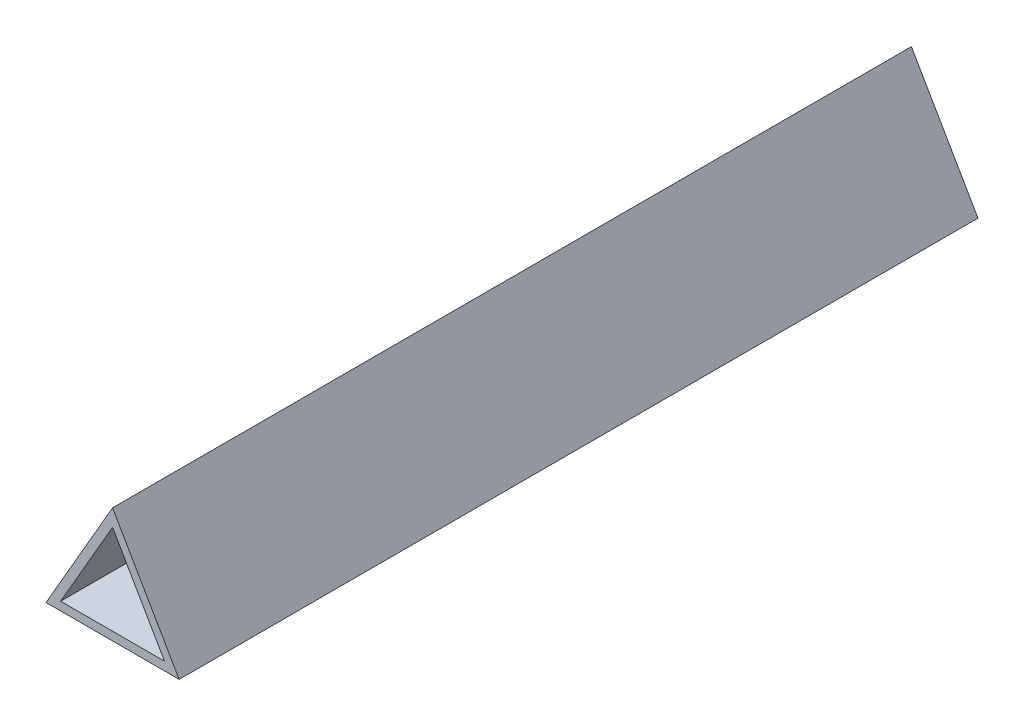
ISO-10303-21;
HEADER;
FILE_DESCRIPTION(('STEP AP214'),'2;1');
FILE_NAME('part.step','',(''),(''),'','','');
FILE_SCHEMA(('AUTOMOTIVE_DESIGN { 1 0 10303 214 1 1 1 1 }'));
ENDSEC;
DATA;
#1=APPLICATION_CONTEXT('core data for automotive mechanical design processes');
#2=APPLICATION_PROTOCOL_DEFINITION('international standard','automotive_design',2000,#1);
#3=PRODUCT_CONTEXT('',#1,'mechanical');
#4=PRODUCT('Part','Part','',(#3));
#5=PRODUCT_RELATED_PRODUCT_CATEGORY('part','',(#4));
#6=PRODUCT_DEFINITION_FORMATION('','',#4);
#7=PRODUCT_DEFINITION_CONTEXT('part definition',#1,'design');
#8=PRODUCT_DEFINITION('design','',#6,#7);
#9=PRODUCT_DEFINITION_SHAPE('','',#8);
#10=(LENGTH_UNIT() NAMED_UNIT(*) SI_UNIT(.MILLI.,.METRE.));
#11=(NAMED_UNIT(*) PLANE_ANGLE_UNIT() SI_UNIT($,.RADIAN.));
#12=(NAMED_UNIT(*) SI_UNIT($,.STERADIAN.) SOLID_ANGLE_UNIT());
#13=UNCERTAINTY_MEASURE_WITH_UNIT(LENGTH_MEASURE(1.E-05),#10,'distance_accuracy_value','');
#14=(GEOMETRIC_REPRESENTATION_CONTEXT(3) GLOBAL_UNCERTAINTY_ASSIGNED_CONTEXT((#13)) GLOBAL_UNIT_ASSIGNED_CONTEXT((#10,
#11,#12)) REPRESENTATION_CONTEXT('',''));
#15=CARTESIAN_POINT('',(0.,0.,0.));
#16=DIRECTION('',(0.,0.,1.));
#17=DIRECTION('',(1.,0.,0.));
#18=AXIS2_PLACEMENT_3D('',#15,#16,#17);
#19=CARTESIAN_POINT('',(0.,0.,300.));
#20=DIRECTION('',(0.,0.,-1.));
#21=DIRECTION('',(-1.,0.,0.));
#22=AXIS2_PLACEMENT_3D('',#19,#20,#21);
#23=PLANE('',#22);
#24=DIRECTION('',(1.,0.,0.));
#25=VECTOR('',#24,1.);
#26=CARTESIAN_POINT('',(49.9999999999999,-1.60079542462932E-13,300.));
#27=LINE('',#26,#25);
#28=CARTESIAN_POINT('',(0.,0.,300.));
#29=VERTEX_POINT('',#28);
#30=CARTESIAN_POINT('',(49.9999999999999,-1.60079542462932E-13,300.));
#31=VERTEX_POINT('',#30);
#32=EDGE_CURVE('E113',#29,#31,#27,.T.);
#33=ORIENTED_EDGE('',*,*,#32,.T.);
#34=DIRECTION('',(-0.499999999999992,0.866025403784443,0.));
#35=VECTOR('',#34,1.);
#36=CARTESIAN_POINT('',(25.0000000000003,43.301270189222,300.));
#37=LINE('',#36,#35);
#38=CARTESIAN_POINT('',(25.0000000000003,43.301270189222,300.));
#39=VERTEX_POINT('',#38);
#40=EDGE_CURVE('E116',#31,#39,#37,.T.);
#41=ORIENTED_EDGE('',*,*,#40,.T.);
#42=DIRECTION('',(-0.500000000000004,-0.866025403784436,0.));
#43=VECTOR('',#42,1.);
#44=CARTESIAN_POINT('',(0.,0.,300.));
#45=LINE('',#44,#43);
#46=EDGE_CURVE('E119',#39,#29,#45,.T.);
#47=ORIENTED_EDGE('',*,*,#46,.T.);
#48=EDGE_LOOP('',(#33,#41,#47));
#49=FACE_BOUND('',#48,.T.);
#50=DIRECTION('',(-0.499999999999992,0.866025403784443,0.));
#51=VECTOR('',#50,1.);
#52=CARTESIAN_POINT('',(44.5007386859687,3.17499999999999,300.));
#53=LINE('',#52,#51);
#54=CARTESIAN_POINT('',(44.5007386859687,3.17499999999999,300.));
#55=VERTEX_POINT('',#54);
#56=CARTESIAN_POINT('',(25.0000000000003,36.951270189222,300.));
#57=VERTEX_POINT('',#56);
#58=EDGE_CURVE('E86',#55,#57,#53,.T.);
#59=ORIENTED_EDGE('',*,*,#58,.F.);
#60=DIRECTION('',(1.,0.,0.));
#61=VECTOR('',#60,1.);
#62=CARTESIAN_POINT('',(5.49926131403122,3.175,300.));
#63=LINE('',#62,#61);
#64=CARTESIAN_POINT('',(5.49926131403122,3.175,300.));
#65=VERTEX_POINT('',#64);
#66=EDGE_CURVE('E103',#65,#55,#63,.T.);
#67=ORIENTED_EDGE('',*,*,#66,.F.);
#68=DIRECTION('',(-0.500000000000004,-0.866025403784436,0.));
#69=VECTOR('',#68,1.);
#70=CARTESIAN_POINT('',(25.0000000000003,36.951270189222,300.));
#71=LINE('',#70,#69);
#72=EDGE_CURVE('E94',#57,#65,#71,.T.);
#73=ORIENTED_EDGE('',*,*,#72,.F.);
#74=EDGE_LOOP('',(#59,#67,#73));
#75=FACE_BOUND('',#74,.T.);
#76=ADVANCED_FACE('F33',(#49,#75),#23,.F.);
#77=CARTESIAN_POINT('',(0.,0.,0.));
#78=DIRECTION('',(0.,0.,-1.));
#79=DIRECTION('',(-1.,0.,0.));
#80=AXIS2_PLACEMENT_3D('',#77,#78,#79);
#81=PLANE('',#80);
#82=DIRECTION('',(1.,0.,0.));
#83=VECTOR('',#82,1.);
#84=CARTESIAN_POINT('',(49.9999999999999,-1.60079542462932E-13,0.));
#85=LINE('',#84,#83);
#86=CARTESIAN_POINT('',(0.,0.,0.));
#87=VERTEX_POINT('',#86);
#88=CARTESIAN_POINT('',(49.9999999999999,-1.60079542462932E-13,0.));
#89=VERTEX_POINT('',#88);
#90=EDGE_CURVE('E101',#87,#89,#85,.T.);
#91=ORIENTED_EDGE('',*,*,#90,.F.);
#92=DIRECTION('',(-0.500000000000004,-0.866025403784436,0.));
#93=VECTOR('',#92,1.);
#94=CARTESIAN_POINT('',(0.,0.,0.));
#95=LINE('',#94,#93);
#96=CARTESIAN_POINT('',(25.0000000000003,43.301270189222,0.));
#97=VERTEX_POINT('',#96);
#98=EDGE_CURVE('E117',#97,#87,#95,.T.);
#99=ORIENTED_EDGE('',*,*,#98,.F.);
#100=DIRECTION('',(-0.499999999999992,0.866025403784443,0.));
#101=VECTOR('',#100,1.);
#102=CARTESIAN_POINT('',(25.0000000000003,43.301270189222,0.));
#103=LINE('',#102,#101);
#104=EDGE_CURVE('E124',#89,#97,#103,.T.);
#105=ORIENTED_EDGE('',*,*,#104,.F.);
#106=EDGE_LOOP('',(#91,#99,#105));
#107=FACE_BOUND('',#106,.T.);
#108=DIRECTION('',(1.,0.,0.));
#109=VECTOR('',#108,1.);
#110=CARTESIAN_POINT('',(5.49926131403122,3.175,0.));
#111=LINE('',#110,#109);
#112=CARTESIAN_POINT('',(5.49926131403122,3.175,0.));
#113=VERTEX_POINT('',#112);
#114=CARTESIAN_POINT('',(44.5007386859687,3.17499999999999,0.));
#115=VERTEX_POINT('',#114);
#116=EDGE_CURVE('E95',#113,#115,#111,.T.);
#117=ORIENTED_EDGE('',*,*,#116,.T.);
#118=DIRECTION('',(-0.499999999999992,0.866025403784443,0.));
#119=VECTOR('',#118,1.);
#120=CARTESIAN_POINT('',(44.5007386859687,3.17499999999999,0.));
#121=LINE('',#120,#119);
#122=CARTESIAN_POINT('',(25.0000000000003,36.951270189222,0.));
#123=VERTEX_POINT('',#122);
#124=EDGE_CURVE('E56',#115,#123,#121,.T.);
#125=ORIENTED_EDGE('',*,*,#124,.T.);
#126=DIRECTION('',(-0.500000000000004,-0.866025403784436,0.));
#127=VECTOR('',#126,1.);
#128=CARTESIAN_POINT('',(25.0000000000003,36.951270189222,0.));
#129=LINE('',#128,#127);
#130=EDGE_CURVE('E100',#123,#113,#129,.T.);
#131=ORIENTED_EDGE('',*,*,#130,.T.);
#132=EDGE_LOOP('',(#117,#125,#131));
#133=FACE_BOUND('',#132,.T.);
#134=ADVANCED_FACE('F138',(#107,#133),#81,.T.);
#135=CARTESIAN_POINT('',(49.9999999999999,-1.60079542462932E-13,300.));
#136=DIRECTION('',(0.,1.,0.));
#137=DIRECTION('',(-1.,0.,0.));
#138=AXIS2_PLACEMENT_3D('',#135,#136,#137);
#139=PLANE('',#138);
#140=ORIENTED_EDGE('',*,*,#90,.T.);
#141=DIRECTION('',(0.,0.,-1.));
#142=VECTOR('',#141,1.);
#143=CARTESIAN_POINT('',(49.9999999999999,-1.60079542462932E-13,300.));
#144=LINE('',#143,#142);
#145=EDGE_CURVE('E11',#31,#89,#144,.T.);
#146=ORIENTED_EDGE('',*,*,#145,.F.);
#147=ORIENTED_EDGE('',*,*,#32,.F.);
#148=DIRECTION('',(0.,0.,-1.));
#149=VECTOR('',#148,1.);
#150=CARTESIAN_POINT('',(0.,0.,300.));
#151=LINE('',#150,#149);
#152=EDGE_CURVE('E121',#29,#87,#151,.T.);
#153=ORIENTED_EDGE('',*,*,#152,.T.);
#154=EDGE_LOOP('',(#140,#146,#147,#153));
#155=FACE_BOUND('',#154,.T.);
#156=ADVANCED_FACE('F35',(#155),#139,.F.);
#157=CARTESIAN_POINT('',(25.0000000000003,43.301270189222,300.));
#158=DIRECTION('',(-0.866025403784443,-0.499999999999992,0.));
#159=DIRECTION('',(0.499999999999992,-0.866025403784444,0.));
#160=AXIS2_PLACEMENT_3D('',#157,#158,#159);
#161=PLANE('',#160);
#162=ORIENTED_EDGE('',*,*,#104,.T.);
#163=DIRECTION('',(0.,0.,-1.));
#164=VECTOR('',#163,1.);
#165=CARTESIAN_POINT('',(25.0000000000003,43.301270189222,300.));
#166=LINE('',#165,#164);
#167=EDGE_CURVE('E41',#39,#97,#166,.T.);
#168=ORIENTED_EDGE('',*,*,#167,.F.);
#169=ORIENTED_EDGE('',*,*,#40,.F.);
#170=ORIENTED_EDGE('',*,*,#145,.T.);
#171=EDGE_LOOP('',(#162,#168,#169,#170));
#172=FACE_BOUND('',#171,.T.);
#173=ADVANCED_FACE('F144',(#172),#161,.F.);
#174=CARTESIAN_POINT('',(0.,0.,300.));
#175=DIRECTION('',(0.866025403784436,-0.500000000000004,0.));
#176=DIRECTION('',(0.500000000000004,0.866025403784436,0.));
#177=AXIS2_PLACEMENT_3D('',#174,#175,#176);
#178=PLANE('',#177);
#179=ORIENTED_EDGE('',*,*,#98,.T.);
#180=ORIENTED_EDGE('',*,*,#152,.F.);
#181=ORIENTED_EDGE('',*,*,#46,.F.);
#182=ORIENTED_EDGE('',*,*,#167,.T.);
#183=EDGE_LOOP('',(#179,#180,#181,#182));
#184=FACE_BOUND('',#183,.T.);
#185=ADVANCED_FACE('F133',(#184),#178,.F.);
#186=CARTESIAN_POINT('',(44.5007386859687,3.17499999999999,300.));
#187=DIRECTION('',(-0.866025403784443,-0.499999999999992,0.));
#188=DIRECTION('',(0.499999999999992,-0.866025403784444,0.));
#189=AXIS2_PLACEMENT_3D('',#186,#187,#188);
#190=PLANE('',#189);
#191=ORIENTED_EDGE('',*,*,#124,.F.);
#192=DIRECTION('',(0.,0.,-1.));
#193=VECTOR('',#192,1.);
#194=CARTESIAN_POINT('',(44.5007386859687,3.17499999999999,300.));
#195=LINE('',#194,#193);
#196=EDGE_CURVE('E90',#55,#115,#195,.T.);
#197=ORIENTED_EDGE('',*,*,#196,.F.);
#198=ORIENTED_EDGE('',*,*,#58,.T.);
#199=DIRECTION('',(0.,0.,-1.));
#200=VECTOR('',#199,1.);
#201=CARTESIAN_POINT('',(25.0000000000003,36.951270189222,300.));
#202=LINE('',#201,#200);
#203=EDGE_CURVE('E89',#57,#123,#202,.T.);
#204=ORIENTED_EDGE('',*,*,#203,.T.);
#205=EDGE_LOOP('',(#191,#197,#198,#204));
#206=FACE_BOUND('',#205,.T.);
#207=ADVANCED_FACE('F88',(#206),#190,.T.);
#208=CARTESIAN_POINT('',(25.0000000000003,36.951270189222,300.));
#209=DIRECTION('',(0.866025403784436,-0.500000000000004,0.));
#210=DIRECTION('',(0.500000000000004,0.866025403784436,0.));
#211=AXIS2_PLACEMENT_3D('',#208,#209,#210);
#212=PLANE('',#211);
#213=ORIENTED_EDGE('',*,*,#130,.F.);
#214=ORIENTED_EDGE('',*,*,#203,.F.);
#215=ORIENTED_EDGE('',*,*,#72,.T.);
#216=DIRECTION('',(0.,0.,-1.));
#217=VECTOR('',#216,1.);
#218=CARTESIAN_POINT('',(5.49926131403122,3.175,300.));
#219=LINE('',#218,#217);
#220=EDGE_CURVE('E48',#65,#113,#219,.T.);
#221=ORIENTED_EDGE('',*,*,#220,.T.);
#222=EDGE_LOOP('',(#213,#214,#215,#221));
#223=FACE_BOUND('',#222,.T.);
#224=ADVANCED_FACE('F98',(#223),#212,.T.);
#225=CARTESIAN_POINT('',(5.49926131403122,3.175,300.));
#226=DIRECTION('',(0.,1.,0.));
#227=DIRECTION('',(-1.,0.,0.));
#228=AXIS2_PLACEMENT_3D('',#225,#226,#227);
#229=PLANE('',#228);
#230=ORIENTED_EDGE('',*,*,#116,.F.);
#231=ORIENTED_EDGE('',*,*,#220,.F.);
#232=ORIENTED_EDGE('',*,*,#66,.T.);
#233=ORIENTED_EDGE('',*,*,#196,.T.);
#234=EDGE_LOOP('',(#230,#231,#232,#233));
#235=FACE_BOUND('',#234,.T.);
#236=ADVANCED_FACE('F162',(#235),#229,.T.);
#237=CLOSED_SHELL('',(#76,#134,#156,#173,#185,#207,#224,#236));
#238=MANIFOLD_SOLID_BREP('B2',#237);
#239=ADVANCED_BREP_SHAPE_REPRESENTATION('',(#18,#238),#14);
#240=SHAPE_DEFINITION_REPRESENTATION(#9,#239);
ENDSEC;
END-ISO-10303-21;
